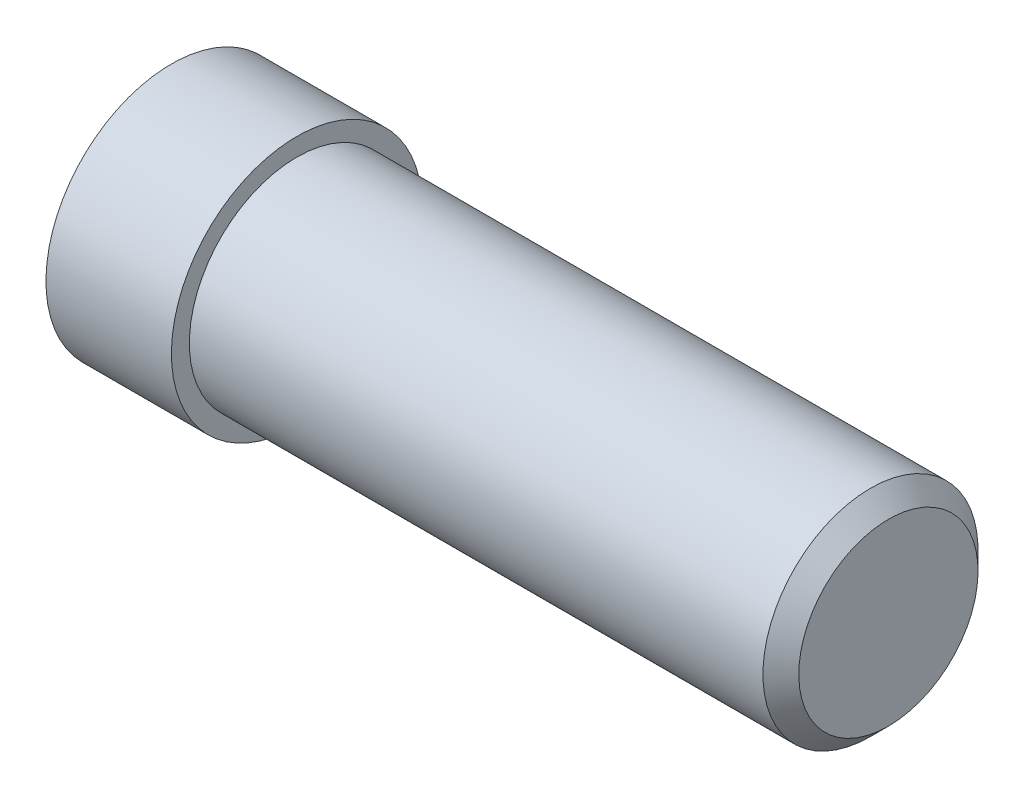
ISO-10303-21;
HEADER;
FILE_DESCRIPTION(('STEP AP214'),'2;1');
FILE_NAME('part.step','',(''),(''),'','','');
FILE_SCHEMA(('AUTOMOTIVE_DESIGN { 1 0 10303 214 1 1 1 1 }'));
ENDSEC;
DATA;
#1=APPLICATION_CONTEXT('core data for automotive mechanical design processes');
#2=APPLICATION_PROTOCOL_DEFINITION('international standard','automotive_design',2000,#1);
#3=PRODUCT_CONTEXT('',#1,'mechanical');
#4=PRODUCT('Part','Part','',(#3));
#5=PRODUCT_RELATED_PRODUCT_CATEGORY('part','',(#4));
#6=PRODUCT_DEFINITION_FORMATION('','',#4);
#7=PRODUCT_DEFINITION_CONTEXT('part definition',#1,'design');
#8=PRODUCT_DEFINITION('design','',#6,#7);
#9=PRODUCT_DEFINITION_SHAPE('','',#8);
#10=(LENGTH_UNIT() NAMED_UNIT(*) SI_UNIT(.MILLI.,.METRE.));
#11=(NAMED_UNIT(*) PLANE_ANGLE_UNIT() SI_UNIT($,.RADIAN.));
#12=(NAMED_UNIT(*) SI_UNIT($,.STERADIAN.) SOLID_ANGLE_UNIT());
#13=UNCERTAINTY_MEASURE_WITH_UNIT(LENGTH_MEASURE(1.E-05),#10,'distance_accuracy_value','');
#14=(GEOMETRIC_REPRESENTATION_CONTEXT(3) GLOBAL_UNCERTAINTY_ASSIGNED_CONTEXT((#13)) GLOBAL_UNIT_ASSIGNED_CONTEXT((#10,
#11,#12)) REPRESENTATION_CONTEXT('',''));
#15=CARTESIAN_POINT('',(0.,0.,0.));
#16=DIRECTION('',(0.,0.,1.));
#17=DIRECTION('',(1.,0.,0.));
#18=AXIS2_PLACEMENT_3D('',#15,#16,#17);
#19=CARTESIAN_POINT('',(0.,0.,0.));
#20=DIRECTION('',(-1.,0.,0.));
#21=DIRECTION('',(0.,-1.,0.));
#22=AXIS2_PLACEMENT_3D('',#19,#20,#21);
#23=PLANE('',#22);
#24=CARTESIAN_POINT('',(0.,0.,0.));
#25=DIRECTION('',(-1.,0.,0.));
#26=DIRECTION('',(0.,-1.,0.));
#27=AXIS2_PLACEMENT_3D('',#24,#25,#26);
#28=CIRCLE('',#27,5.);
#29=CARTESIAN_POINT('',(0.,-5.,0.));
#30=VERTEX_POINT('',#29);
#31=EDGE_CURVE('E10',#30,#30,#28,.F.);
#32=ORIENTED_EDGE('',*,*,#31,.T.);
#33=EDGE_LOOP('',(#32));
#34=FACE_BOUND('',#33,.T.);
#35=ADVANCED_FACE('F39',(#34),#23,.F.);
#36=CARTESIAN_POINT('',(-40.,0.,0.));
#37=DIRECTION('',(-1.,0.,0.));
#38=DIRECTION('',(0.,-1.,0.));
#39=AXIS2_PLACEMENT_3D('',#36,#37,#38);
#40=CYLINDRICAL_SURFACE('',#39,6.);
#41=CARTESIAN_POINT('',(-1.,0.,0.));
#42=DIRECTION('',(-1.,0.,0.));
#43=DIRECTION('',(0.,-1.,0.));
#44=AXIS2_PLACEMENT_3D('',#41,#42,#43);
#45=CIRCLE('',#44,6.);
#46=CARTESIAN_POINT('',(-1.,-6.,0.));
#47=VERTEX_POINT('',#46);
#48=EDGE_CURVE('E50',#47,#47,#45,.T.);
#49=ORIENTED_EDGE('',*,*,#48,.T.);
#50=EDGE_LOOP('',(#49));
#51=FACE_BOUND('',#50,.T.);
#52=CARTESIAN_POINT('',(-33.,0.,0.));
#53=DIRECTION('',(-1.,0.,0.));
#54=DIRECTION('',(0.,-1.,0.));
#55=AXIS2_PLACEMENT_3D('',#52,#53,#54);
#56=CIRCLE('',#55,6.);
#57=CARTESIAN_POINT('',(-33.,-6.00000000000001,0.));
#58=VERTEX_POINT('',#57);
#59=EDGE_CURVE('E51',#58,#58,#56,.T.);
#60=ORIENTED_EDGE('',*,*,#59,.F.);
#61=EDGE_LOOP('',(#60));
#62=FACE_BOUND('',#61,.T.);
#63=ADVANCED_FACE('F73',(#51,#62),#40,.T.);
#64=CARTESIAN_POINT('',(-33.,6.,0.));
#65=DIRECTION('',(-1.,0.,0.));
#66=DIRECTION('',(0.,-1.,0.));
#67=AXIS2_PLACEMENT_3D('',#64,#65,#66);
#68=PLANE('',#67);
#69=CARTESIAN_POINT('',(-33.,0.,0.));
#70=DIRECTION('',(-1.,0.,0.));
#71=DIRECTION('',(0.,-1.,0.));
#72=AXIS2_PLACEMENT_3D('',#69,#70,#71);
#73=CIRCLE('',#72,7.);
#74=CARTESIAN_POINT('',(-33.,-7.00000000000001,0.));
#75=VERTEX_POINT('',#74);
#76=EDGE_CURVE('E54',#75,#75,#73,.T.);
#77=ORIENTED_EDGE('',*,*,#76,.F.);
#78=EDGE_LOOP('',(#77));
#79=FACE_BOUND('',#78,.T.);
#80=ORIENTED_EDGE('',*,*,#59,.T.);
#81=EDGE_LOOP('',(#80));
#82=FACE_BOUND('',#81,.T.);
#83=ADVANCED_FACE('F69',(#79,#82),#68,.F.);
#84=CARTESIAN_POINT('',(-40.,0.,0.));
#85=DIRECTION('',(-1.,0.,0.));
#86=DIRECTION('',(0.,-1.,0.));
#87=AXIS2_PLACEMENT_3D('',#84,#85,#86);
#88=CYLINDRICAL_SURFACE('',#87,7.);
#89=CARTESIAN_POINT('',(-40.,0.,0.));
#90=DIRECTION('',(-1.,0.,0.));
#91=DIRECTION('',(0.,-1.,0.));
#92=AXIS2_PLACEMENT_3D('',#89,#90,#91);
#93=CIRCLE('',#92,7.);
#94=CARTESIAN_POINT('',(-40.,-7.00000000000001,0.));
#95=VERTEX_POINT('',#94);
#96=EDGE_CURVE('E58',#95,#95,#93,.T.);
#97=ORIENTED_EDGE('',*,*,#96,.F.);
#98=EDGE_LOOP('',(#97));
#99=FACE_BOUND('',#98,.T.);
#100=ORIENTED_EDGE('',*,*,#76,.T.);
#101=EDGE_LOOP('',(#100));
#102=FACE_BOUND('',#101,.T.);
#103=ADVANCED_FACE('F68',(#99,#102),#88,.T.);
#104=CARTESIAN_POINT('',(-40.,6.99999999999999,0.));
#105=DIRECTION('',(1.,0.,0.));
#106=DIRECTION('',(0.,1.,0.));
#107=AXIS2_PLACEMENT_3D('',#104,#105,#106);
#108=PLANE('',#107);
#109=ORIENTED_EDGE('',*,*,#96,.T.);
#110=EDGE_LOOP('',(#109));
#111=FACE_BOUND('',#110,.T.);
#112=ADVANCED_FACE('F61',(#111),#108,.F.);
#113=CARTESIAN_POINT('',(-1.,0.,0.));
#114=DIRECTION('',(-1.,0.,0.));
#115=DIRECTION('',(0.,-1.,0.));
#116=AXIS2_PLACEMENT_3D('',#113,#114,#115);
#117=CONICAL_SURFACE('',#116,6.,0.78539816339745);
#118=ORIENTED_EDGE('',*,*,#31,.F.);
#119=EDGE_LOOP('',(#118));
#120=FACE_BOUND('',#119,.T.);
#121=ORIENTED_EDGE('',*,*,#48,.F.);
#122=EDGE_LOOP('',(#121));
#123=FACE_BOUND('',#122,.T.);
#124=ADVANCED_FACE('F45',(#120,#123),#117,.T.);
#125=CLOSED_SHELL('',(#35,#63,#83,#103,#112,#124));
#126=MANIFOLD_SOLID_BREP('B2',#125);
#127=ADVANCED_BREP_SHAPE_REPRESENTATION('',(#18,#126),#14);
#128=SHAPE_DEFINITION_REPRESENTATION(#9,#127);
ENDSEC;
END-ISO-10303-21;
